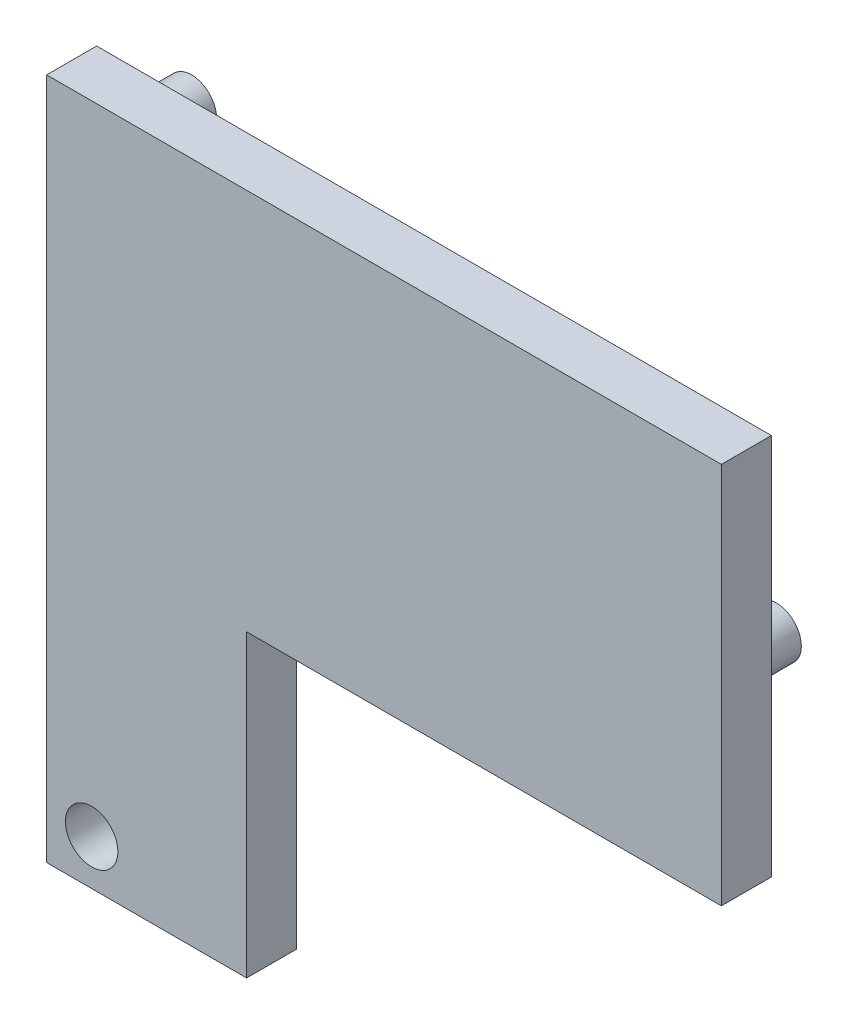
ISO-10303-21;
HEADER;
FILE_DESCRIPTION(('STEP AP214'),'2;1');
FILE_NAME('part.step','',(''),(''),'','','');
FILE_SCHEMA(('AUTOMOTIVE_DESIGN { 1 0 10303 214 1 1 1 1 }'));
ENDSEC;
DATA;
#1=APPLICATION_CONTEXT('core data for automotive mechanical design processes');
#2=APPLICATION_PROTOCOL_DEFINITION('international standard','automotive_design',2000,#1);
#3=PRODUCT_CONTEXT('',#1,'mechanical');
#4=PRODUCT('Part','Part','',(#3));
#5=PRODUCT_RELATED_PRODUCT_CATEGORY('part','',(#4));
#6=PRODUCT_DEFINITION_FORMATION('','',#4);
#7=PRODUCT_DEFINITION_CONTEXT('part definition',#1,'design');
#8=PRODUCT_DEFINITION('design','',#6,#7);
#9=PRODUCT_DEFINITION_SHAPE('','',#8);
#10=(LENGTH_UNIT() NAMED_UNIT(*) SI_UNIT(.MILLI.,.METRE.));
#11=(NAMED_UNIT(*) PLANE_ANGLE_UNIT() SI_UNIT($,.RADIAN.));
#12=(NAMED_UNIT(*) SI_UNIT($,.STERADIAN.) SOLID_ANGLE_UNIT());
#13=UNCERTAINTY_MEASURE_WITH_UNIT(LENGTH_MEASURE(1.E-05),#10,'distance_accuracy_value','');
#14=(GEOMETRIC_REPRESENTATION_CONTEXT(3) GLOBAL_UNCERTAINTY_ASSIGNED_CONTEXT((#13)) GLOBAL_UNIT_ASSIGNED_CONTEXT((#10,
#11,#12)) REPRESENTATION_CONTEXT('',''));
#15=CARTESIAN_POINT('',(0.,0.,0.));
#16=DIRECTION('',(0.,0.,1.));
#17=DIRECTION('',(1.,0.,0.));
#18=AXIS2_PLACEMENT_3D('',#15,#16,#17);
#19=CARTESIAN_POINT('',(0.,0.,2.));
#20=DIRECTION('',(0.,0.,-1.));
#21=DIRECTION('',(-1.,0.,0.));
#22=AXIS2_PLACEMENT_3D('',#19,#20,#21);
#23=PLANE('',#22);
#24=DIRECTION('',(0.,-1.,0.));
#25=VECTOR('',#24,1.);
#26=CARTESIAN_POINT('',(-53.65,-57.3,2.));
#27=LINE('',#26,#25);
#28=CARTESIAN_POINT('',(-53.65,-30.,2.));
#29=VERTEX_POINT('',#28);
#30=CARTESIAN_POINT('',(-53.65,-57.3,2.));
#31=VERTEX_POINT('',#30);
#32=EDGE_CURVE('E133',#29,#31,#27,.T.);
#33=ORIENTED_EDGE('',*,*,#32,.T.);
#34=DIRECTION('',(1.,0.,0.));
#35=VECTOR('',#34,1.);
#36=CARTESIAN_POINT('',(-53.65,-57.3,2.));
#37=LINE('',#36,#35);
#38=CARTESIAN_POINT('',(-45.65,-57.3,2.));
#39=VERTEX_POINT('',#38);
#40=EDGE_CURVE('E91',#31,#39,#37,.T.);
#41=ORIENTED_EDGE('',*,*,#40,.T.);
#42=DIRECTION('',(0.,1.,0.));
#43=VECTOR('',#42,1.);
#44=CARTESIAN_POINT('',(-45.65,-57.3,2.));
#45=LINE('',#44,#43);
#46=CARTESIAN_POINT('',(-45.65,-45.3,2.));
#47=VERTEX_POINT('',#46);
#48=EDGE_CURVE('E104',#39,#47,#45,.T.);
#49=ORIENTED_EDGE('',*,*,#48,.T.);
#50=DIRECTION('',(1.,0.,0.));
#51=VECTOR('',#50,1.);
#52=CARTESIAN_POINT('',(-45.65,-45.3,2.));
#53=LINE('',#52,#51);
#54=CARTESIAN_POINT('',(-26.65,-45.3,2.));
#55=VERTEX_POINT('',#54);
#56=EDGE_CURVE('E98',#47,#55,#53,.T.);
#57=ORIENTED_EDGE('',*,*,#56,.T.);
#58=DIRECTION('',(0.,1.,0.));
#59=VECTOR('',#58,1.);
#60=CARTESIAN_POINT('',(-26.65,-45.3,2.));
#61=LINE('',#60,#59);
#62=CARTESIAN_POINT('',(-26.65,-30.,2.));
#63=VERTEX_POINT('',#62);
#64=EDGE_CURVE('E102',#55,#63,#61,.T.);
#65=ORIENTED_EDGE('',*,*,#64,.T.);
#66=DIRECTION('',(-1.,0.,0.));
#67=VECTOR('',#66,1.);
#68=CARTESIAN_POINT('',(-53.65,-30.,2.));
#69=LINE('',#68,#67);
#70=EDGE_CURVE('E53',#63,#29,#69,.T.);
#71=ORIENTED_EDGE('',*,*,#70,.T.);
#72=EDGE_LOOP('',(#33,#41,#49,#57,#65,#71));
#73=FACE_BOUND('',#72,.T.);
#74=CARTESIAN_POINT('',(-51.85,-55.5,2.));
#75=DIRECTION('',(0.,0.,1.));
#76=DIRECTION('',(1.,0.,0.));
#77=AXIS2_PLACEMENT_3D('',#74,#75,#76);
#78=CIRCLE('',#77,1.05);
#79=CARTESIAN_POINT('',(-50.8,-55.5,2.));
#80=VERTEX_POINT('',#79);
#81=EDGE_CURVE('E126',#80,#80,#78,.T.);
#82=ORIENTED_EDGE('',*,*,#81,.F.);
#83=EDGE_LOOP('',(#82));
#84=FACE_BOUND('',#83,.T.);
#85=ADVANCED_FACE('F36',(#73,#84),#23,.F.);
#86=CARTESIAN_POINT('',(0.,0.,0.));
#87=DIRECTION('',(0.,0.,-1.));
#88=DIRECTION('',(-1.,0.,0.));
#89=AXIS2_PLACEMENT_3D('',#86,#87,#88);
#90=PLANE('',#89);
#91=CARTESIAN_POINT('',(-51.85,-32.1,0.));
#92=DIRECTION('',(0.,0.,-1.));
#93=DIRECTION('',(-1.,0.,0.));
#94=AXIS2_PLACEMENT_3D('',#91,#92,#93);
#95=CIRCLE('',#94,0.999999999999998);
#96=CARTESIAN_POINT('',(-52.85,-32.1,0.));
#97=VERTEX_POINT('',#96);
#98=EDGE_CURVE('E11',#97,#97,#95,.T.);
#99=ORIENTED_EDGE('',*,*,#98,.F.);
#100=EDGE_LOOP('',(#99));
#101=FACE_BOUND('',#100,.T.);
#102=CARTESIAN_POINT('',(-28.45,-38.7,0.));
#103=DIRECTION('',(0.,0.,-1.));
#104=DIRECTION('',(-1.,0.,0.));
#105=AXIS2_PLACEMENT_3D('',#102,#103,#104);
#106=CIRCLE('',#105,1.);
#107=CARTESIAN_POINT('',(-29.45,-38.7,0.));
#108=VERTEX_POINT('',#107);
#109=EDGE_CURVE('E45',#108,#108,#106,.T.);
#110=ORIENTED_EDGE('',*,*,#109,.F.);
#111=EDGE_LOOP('',(#110));
#112=FACE_BOUND('',#111,.T.);
#113=DIRECTION('',(0.,-1.,0.));
#114=VECTOR('',#113,1.);
#115=CARTESIAN_POINT('',(-53.65,-57.3,0.));
#116=LINE('',#115,#114);
#117=CARTESIAN_POINT('',(-53.65,-30.,0.));
#118=VERTEX_POINT('',#117);
#119=CARTESIAN_POINT('',(-53.65,-57.3,0.));
#120=VERTEX_POINT('',#119);
#121=EDGE_CURVE('E122',#118,#120,#116,.T.);
#122=ORIENTED_EDGE('',*,*,#121,.F.);
#123=DIRECTION('',(-1.,0.,0.));
#124=VECTOR('',#123,1.);
#125=CARTESIAN_POINT('',(-53.65,-30.,0.));
#126=LINE('',#125,#124);
#127=CARTESIAN_POINT('',(-26.65,-30.,0.));
#128=VERTEX_POINT('',#127);
#129=EDGE_CURVE('E82',#128,#118,#126,.T.);
#130=ORIENTED_EDGE('',*,*,#129,.F.);
#131=DIRECTION('',(0.,1.,0.));
#132=VECTOR('',#131,1.);
#133=CARTESIAN_POINT('',(-26.65,-45.3,0.));
#134=LINE('',#133,#132);
#135=CARTESIAN_POINT('',(-26.65,-45.3,0.));
#136=VERTEX_POINT('',#135);
#137=EDGE_CURVE('E76',#136,#128,#134,.T.);
#138=ORIENTED_EDGE('',*,*,#137,.F.);
#139=DIRECTION('',(1.,0.,0.));
#140=VECTOR('',#139,1.);
#141=CARTESIAN_POINT('',(-45.65,-45.3,0.));
#142=LINE('',#141,#140);
#143=CARTESIAN_POINT('',(-45.65,-45.3,0.));
#144=VERTEX_POINT('',#143);
#145=EDGE_CURVE('E112',#144,#136,#142,.T.);
#146=ORIENTED_EDGE('',*,*,#145,.F.);
#147=DIRECTION('',(0.,1.,0.));
#148=VECTOR('',#147,1.);
#149=CARTESIAN_POINT('',(-45.65,-57.3,0.));
#150=LINE('',#149,#148);
#151=CARTESIAN_POINT('',(-45.65,-57.3,0.));
#152=VERTEX_POINT('',#151);
#153=EDGE_CURVE('E128',#152,#144,#150,.T.);
#154=ORIENTED_EDGE('',*,*,#153,.F.);
#155=DIRECTION('',(1.,0.,0.));
#156=VECTOR('',#155,1.);
#157=CARTESIAN_POINT('',(-53.65,-57.3,0.));
#158=LINE('',#157,#156);
#159=EDGE_CURVE('E125',#120,#152,#158,.T.);
#160=ORIENTED_EDGE('',*,*,#159,.F.);
#161=EDGE_LOOP('',(#122,#130,#138,#146,#154,#160));
#162=FACE_BOUND('',#161,.T.);
#163=CARTESIAN_POINT('',(-51.85,-55.5,0.));
#164=DIRECTION('',(0.,0.,1.));
#165=DIRECTION('',(1.,0.,0.));
#166=AXIS2_PLACEMENT_3D('',#163,#164,#165);
#167=CIRCLE('',#166,1.05);
#168=CARTESIAN_POINT('',(-50.8,-55.5,0.));
#169=VERTEX_POINT('',#168);
#170=EDGE_CURVE('E156',#169,#169,#167,.T.);
#171=ORIENTED_EDGE('',*,*,#170,.T.);
#172=EDGE_LOOP('',(#171));
#173=FACE_BOUND('',#172,.T.);
#174=ADVANCED_FACE('F147',(#101,#112,#162,#173),#90,.T.);
#175=CARTESIAN_POINT('',(-53.65,-57.3,2.));
#176=DIRECTION('',(1.,0.,0.));
#177=DIRECTION('',(0.,1.,0.));
#178=AXIS2_PLACEMENT_3D('',#175,#176,#177);
#179=PLANE('',#178);
#180=ORIENTED_EDGE('',*,*,#121,.T.);
#181=DIRECTION('',(0.,0.,-1.));
#182=VECTOR('',#181,1.);
#183=CARTESIAN_POINT('',(-53.65,-57.3,2.));
#184=LINE('',#183,#182);
#185=EDGE_CURVE('E140',#31,#120,#184,.T.);
#186=ORIENTED_EDGE('',*,*,#185,.F.);
#187=ORIENTED_EDGE('',*,*,#32,.F.);
#188=DIRECTION('',(0.,0.,-1.));
#189=VECTOR('',#188,1.);
#190=CARTESIAN_POINT('',(-53.65,-30.,2.));
#191=LINE('',#190,#189);
#192=EDGE_CURVE('E118',#29,#118,#191,.T.);
#193=ORIENTED_EDGE('',*,*,#192,.T.);
#194=EDGE_LOOP('',(#180,#186,#187,#193));
#195=FACE_BOUND('',#194,.T.);
#196=ADVANCED_FACE('F38',(#195),#179,.F.);
#197=CARTESIAN_POINT('',(-53.65,-57.3,2.));
#198=DIRECTION('',(0.,1.,0.));
#199=DIRECTION('',(0.,0.,1.));
#200=AXIS2_PLACEMENT_3D('',#197,#198,#199);
#201=PLANE('',#200);
#202=ORIENTED_EDGE('',*,*,#159,.T.);
#203=DIRECTION('',(0.,0.,-1.));
#204=VECTOR('',#203,1.);
#205=CARTESIAN_POINT('',(-45.65,-57.3,2.));
#206=LINE('',#205,#204);
#207=EDGE_CURVE('E137',#39,#152,#206,.T.);
#208=ORIENTED_EDGE('',*,*,#207,.F.);
#209=ORIENTED_EDGE('',*,*,#40,.F.);
#210=ORIENTED_EDGE('',*,*,#185,.T.);
#211=EDGE_LOOP('',(#202,#208,#209,#210));
#212=FACE_BOUND('',#211,.T.);
#213=ADVANCED_FACE('F169',(#212),#201,.F.);
#214=CARTESIAN_POINT('',(-45.65,-57.3,2.));
#215=DIRECTION('',(-1.,0.,0.));
#216=DIRECTION('',(0.,0.,1.));
#217=AXIS2_PLACEMENT_3D('',#214,#215,#216);
#218=PLANE('',#217);
#219=ORIENTED_EDGE('',*,*,#153,.T.);
#220=DIRECTION('',(0.,0.,-1.));
#221=VECTOR('',#220,1.);
#222=CARTESIAN_POINT('',(-45.65,-45.3,2.));
#223=LINE('',#222,#221);
#224=EDGE_CURVE('E113',#47,#144,#223,.T.);
#225=ORIENTED_EDGE('',*,*,#224,.F.);
#226=ORIENTED_EDGE('',*,*,#48,.F.);
#227=ORIENTED_EDGE('',*,*,#207,.T.);
#228=EDGE_LOOP('',(#219,#225,#226,#227));
#229=FACE_BOUND('',#228,.T.);
#230=ADVANCED_FACE('F172',(#229),#218,.F.);
#231=CARTESIAN_POINT('',(-45.65,-45.3,2.));
#232=DIRECTION('',(0.,1.,0.));
#233=DIRECTION('',(0.,0.,1.));
#234=AXIS2_PLACEMENT_3D('',#231,#232,#233);
#235=PLANE('',#234);
#236=ORIENTED_EDGE('',*,*,#145,.T.);
#237=DIRECTION('',(0.,0.,-1.));
#238=VECTOR('',#237,1.);
#239=CARTESIAN_POINT('',(-26.65,-45.3,2.));
#240=LINE('',#239,#238);
#241=EDGE_CURVE('E109',#55,#136,#240,.T.);
#242=ORIENTED_EDGE('',*,*,#241,.F.);
#243=ORIENTED_EDGE('',*,*,#56,.F.);
#244=ORIENTED_EDGE('',*,*,#224,.T.);
#245=EDGE_LOOP('',(#236,#242,#243,#244));
#246=FACE_BOUND('',#245,.T.);
#247=ADVANCED_FACE('F110',(#246),#235,.F.);
#248=CARTESIAN_POINT('',(-26.65,-45.3,2.));
#249=DIRECTION('',(-1.,0.,0.));
#250=DIRECTION('',(0.,0.,1.));
#251=AXIS2_PLACEMENT_3D('',#248,#249,#250);
#252=PLANE('',#251);
#253=ORIENTED_EDGE('',*,*,#137,.T.);
#254=DIRECTION('',(0.,0.,-1.));
#255=VECTOR('',#254,1.);
#256=CARTESIAN_POINT('',(-26.65,-30.,2.));
#257=LINE('',#256,#255);
#258=EDGE_CURVE('E114',#63,#128,#257,.T.);
#259=ORIENTED_EDGE('',*,*,#258,.F.);
#260=ORIENTED_EDGE('',*,*,#64,.F.);
#261=ORIENTED_EDGE('',*,*,#241,.T.);
#262=EDGE_LOOP('',(#253,#259,#260,#261));
#263=FACE_BOUND('',#262,.T.);
#264=ADVANCED_FACE('F116',(#263),#252,.F.);
#265=CARTESIAN_POINT('',(-53.65,-30.,2.));
#266=DIRECTION('',(0.,-1.,0.));
#267=DIRECTION('',(0.,0.,-1.));
#268=AXIS2_PLACEMENT_3D('',#265,#266,#267);
#269=PLANE('',#268);
#270=ORIENTED_EDGE('',*,*,#129,.T.);
#271=ORIENTED_EDGE('',*,*,#192,.F.);
#272=ORIENTED_EDGE('',*,*,#70,.F.);
#273=ORIENTED_EDGE('',*,*,#258,.T.);
#274=EDGE_LOOP('',(#270,#271,#272,#273));
#275=FACE_BOUND('',#274,.T.);
#276=ADVANCED_FACE('F174',(#275),#269,.F.);
#277=CARTESIAN_POINT('',(-51.85,-55.5,2.));
#278=DIRECTION('',(0.,0.,-1.));
#279=DIRECTION('',(-1.,0.,0.));
#280=AXIS2_PLACEMENT_3D('',#277,#278,#279);
#281=CYLINDRICAL_SURFACE('',#280,1.05);
#282=ORIENTED_EDGE('',*,*,#81,.T.);
#283=EDGE_LOOP('',(#282));
#284=FACE_BOUND('',#283,.T.);
#285=ORIENTED_EDGE('',*,*,#170,.F.);
#286=EDGE_LOOP('',(#285));
#287=FACE_BOUND('',#286,.T.);
#288=ADVANCED_FACE('F176',(#284,#287),#281,.F.);
#289=CARTESIAN_POINT('',(-28.45,-38.7,-2.));
#290=DIRECTION('',(0.,0.,1.));
#291=DIRECTION('',(1.,0.,0.));
#292=AXIS2_PLACEMENT_3D('',#289,#290,#291);
#293=CYLINDRICAL_SURFACE('',#292,1.);
#294=ORIENTED_EDGE('',*,*,#109,.T.);
#295=EDGE_LOOP('',(#294));
#296=FACE_BOUND('',#295,.T.);
#297=CARTESIAN_POINT('',(-28.45,-38.7,-2.));
#298=DIRECTION('',(0.,0.,1.));
#299=DIRECTION('',(1.,0.,0.));
#300=AXIS2_PLACEMENT_3D('',#297,#298,#299);
#301=CIRCLE('',#300,1.);
#302=CARTESIAN_POINT('',(-27.45,-38.7,-2.));
#303=VERTEX_POINT('',#302);
#304=EDGE_CURVE('E158',#303,#303,#301,.T.);
#305=ORIENTED_EDGE('',*,*,#304,.T.);
#306=EDGE_LOOP('',(#305));
#307=FACE_BOUND('',#306,.T.);
#308=ADVANCED_FACE('F144',(#296,#307),#293,.T.);
#309=CARTESIAN_POINT('',(-28.45,-38.7,-2.));
#310=DIRECTION('',(0.,0.,1.));
#311=DIRECTION('',(1.,0.,0.));
#312=AXIS2_PLACEMENT_3D('',#309,#310,#311);
#313=PLANE('',#312);
#314=ORIENTED_EDGE('',*,*,#304,.F.);
#315=EDGE_LOOP('',(#314));
#316=FACE_BOUND('',#315,.T.);
#317=ADVANCED_FACE('F192',(#316),#313,.F.);
#318=CARTESIAN_POINT('',(-51.85,-32.1,-2.));
#319=DIRECTION('',(0.,0.,1.));
#320=DIRECTION('',(1.,0.,0.));
#321=AXIS2_PLACEMENT_3D('',#318,#319,#320);
#322=CYLINDRICAL_SURFACE('',#321,0.999999999999998);
#323=ORIENTED_EDGE('',*,*,#98,.T.);
#324=EDGE_LOOP('',(#323));
#325=FACE_BOUND('',#324,.T.);
#326=CARTESIAN_POINT('',(-51.85,-32.1,-2.));
#327=DIRECTION('',(0.,0.,1.));
#328=DIRECTION('',(1.,0.,0.));
#329=AXIS2_PLACEMENT_3D('',#326,#327,#328);
#330=CIRCLE('',#329,0.999999999999998);
#331=CARTESIAN_POINT('',(-50.85,-32.1,-2.));
#332=VERTEX_POINT('',#331);
#333=EDGE_CURVE('E163',#332,#332,#330,.T.);
#334=ORIENTED_EDGE('',*,*,#333,.T.);
#335=EDGE_LOOP('',(#334));
#336=FACE_BOUND('',#335,.T.);
#337=ADVANCED_FACE('F195',(#325,#336),#322,.T.);
#338=CARTESIAN_POINT('',(-51.85,-32.1,-2.));
#339=DIRECTION('',(0.,0.,1.));
#340=DIRECTION('',(1.,0.,0.));
#341=AXIS2_PLACEMENT_3D('',#338,#339,#340);
#342=PLANE('',#341);
#343=ORIENTED_EDGE('',*,*,#333,.F.);
#344=EDGE_LOOP('',(#343));
#345=FACE_BOUND('',#344,.T.);
#346=ADVANCED_FACE('F199',(#345),#342,.F.);
#347=CLOSED_SHELL('',(#85,#174,#196,#213,#230,#247,#264,#276,#288,#308,#317,#337,#346));
#348=MANIFOLD_SOLID_BREP('B2',#347);
#349=ADVANCED_BREP_SHAPE_REPRESENTATION('',(#18,#348),#14);
#350=SHAPE_DEFINITION_REPRESENTATION(#9,#349);
ENDSEC;
END-ISO-10303-21;
